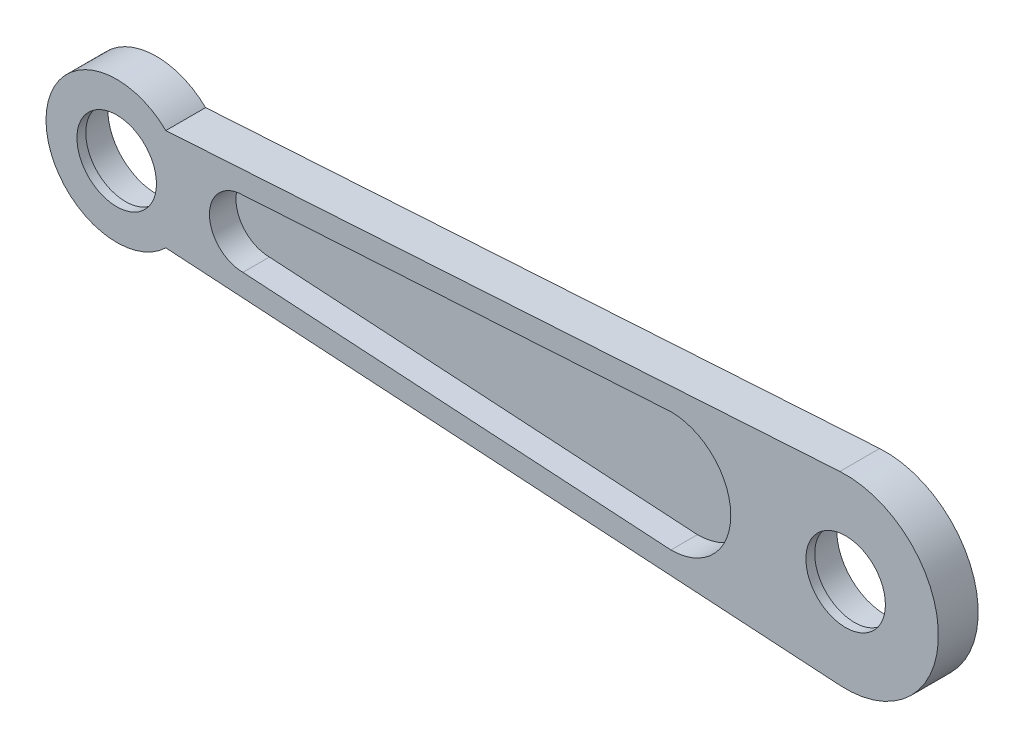
ISO-10303-21;
HEADER;
FILE_DESCRIPTION(('STEP AP214'),'2;1');
FILE_NAME('part.step','',(''),(''),'','','');
FILE_SCHEMA(('AUTOMOTIVE_DESIGN { 1 0 10303 214 1 1 1 1 }'));
ENDSEC;
DATA;
#1=APPLICATION_CONTEXT('core data for automotive mechanical design processes');
#2=APPLICATION_PROTOCOL_DEFINITION('international standard','automotive_design',2000,#1);
#3=PRODUCT_CONTEXT('',#1,'mechanical');
#4=PRODUCT('Part','Part','',(#3));
#5=PRODUCT_RELATED_PRODUCT_CATEGORY('part','',(#4));
#6=PRODUCT_DEFINITION_FORMATION('','',#4);
#7=PRODUCT_DEFINITION_CONTEXT('part definition',#1,'design');
#8=PRODUCT_DEFINITION('design','',#6,#7);
#9=PRODUCT_DEFINITION_SHAPE('','',#8);
#10=(LENGTH_UNIT() NAMED_UNIT(*) SI_UNIT(.MILLI.,.METRE.));
#11=(NAMED_UNIT(*) PLANE_ANGLE_UNIT() SI_UNIT($,.RADIAN.));
#12=(NAMED_UNIT(*) SI_UNIT($,.STERADIAN.) SOLID_ANGLE_UNIT());
#13=UNCERTAINTY_MEASURE_WITH_UNIT(LENGTH_MEASURE(1.E-05),#10,'distance_accuracy_value','');
#14=(GEOMETRIC_REPRESENTATION_CONTEXT(3) GLOBAL_UNCERTAINTY_ASSIGNED_CONTEXT((#13)) GLOBAL_UNIT_ASSIGNED_CONTEXT((#10,
#11,#12)) REPRESENTATION_CONTEXT('',''));
#15=CARTESIAN_POINT('',(0.,0.,0.));
#16=DIRECTION('',(0.,0.,1.));
#17=DIRECTION('',(1.,0.,0.));
#18=AXIS2_PLACEMENT_3D('',#15,#16,#17);
#19=CARTESIAN_POINT('',(0.,0.,9.));
#20=DIRECTION('',(0.,0.,1.));
#21=DIRECTION('',(1.,0.,0.));
#22=AXIS2_PLACEMENT_3D('',#19,#20,#21);
#23=PLANE('',#22);
#24=CARTESIAN_POINT('',(165.,0.,9.));
#25=DIRECTION('',(0.,0.,1.));
#26=DIRECTION('',(1.,0.,0.));
#27=AXIS2_PLACEMENT_3D('',#24,#25,#26);
#28=CIRCLE('',#27,9.00000000000001);
#29=CARTESIAN_POINT('',(174.,0.,9.));
#30=VERTEX_POINT('',#29);
#31=EDGE_CURVE('E211',#30,#30,#28,.T.);
#32=ORIENTED_EDGE('',*,*,#31,.F.);
#33=EDGE_LOOP('',(#32));
#34=FACE_BOUND('',#33,.T.);
#35=CARTESIAN_POINT('',(0.,0.,9.));
#36=DIRECTION('',(0.,0.,1.));
#37=DIRECTION('',(1.,0.,0.));
#38=AXIS2_PLACEMENT_3D('',#35,#36,#37);
#39=CIRCLE('',#38,9.);
#40=CARTESIAN_POINT('',(9.,0.,9.));
#41=VERTEX_POINT('',#40);
#42=EDGE_CURVE('E216',#41,#41,#39,.T.);
#43=ORIENTED_EDGE('',*,*,#42,.F.);
#44=EDGE_LOOP('',(#43));
#45=FACE_BOUND('',#44,.T.);
#46=DIRECTION('',(0.998083511417436,-0.0618813722911973,0.));
#47=VECTOR('',#46,1.);
#48=CARTESIAN_POINT('',(-0.667673619069252,-10.7688954773911,9.));
#49=LINE('',#48,#47);
#50=CARTESIAN_POINT('',(11.1242977306435,-11.5,9.));
#51=VERTEX_POINT('',#50);
#52=CARTESIAN_POINT('',(163.700491181885,-20.9597537397661,9.));
#53=VERTEX_POINT('',#52);
#54=EDGE_CURVE('E222',#51,#53,#49,.T.);
#55=ORIENTED_EDGE('',*,*,#54,.T.);
#56=CARTESIAN_POINT('',(165.,0.,9.));
#57=DIRECTION('',(0.,0.,1.));
#58=DIRECTION('',(1.,0.,0.));
#59=AXIS2_PLACEMENT_3D('',#56,#57,#58);
#60=CIRCLE('',#59,21.);
#61=CARTESIAN_POINT('',(163.700491181885,20.9597537397661,9.));
#62=VERTEX_POINT('',#61);
#63=EDGE_CURVE('E249',#53,#62,#60,.T.);
#64=ORIENTED_EDGE('',*,*,#63,.T.);
#65=DIRECTION('',(0.998083511417436,0.0618813722911973,0.));
#66=VECTOR('',#65,1.);
#67=CARTESIAN_POINT('',(-0.667673619069252,10.7688954773911,9.));
#68=LINE('',#67,#66);
#69=CARTESIAN_POINT('',(11.1242977306435,11.5,9.));
#70=VERTEX_POINT('',#69);
#71=EDGE_CURVE('E219',#70,#62,#68,.T.);
#72=ORIENTED_EDGE('',*,*,#71,.F.);
#73=CARTESIAN_POINT('',(0.,0.,9.));
#74=DIRECTION('',(0.,0.,1.));
#75=DIRECTION('',(1.,0.,0.));
#76=AXIS2_PLACEMENT_3D('',#73,#74,#75);
#77=CIRCLE('',#76,16.);
#78=EDGE_CURVE('E231',#70,#51,#77,.T.);
#79=ORIENTED_EDGE('',*,*,#78,.T.);
#80=EDGE_LOOP('',(#55,#64,#72,#79));
#81=FACE_BOUND('',#80,.T.);
#82=CARTESIAN_POINT('',(125.447559307516,0.,9.));
#83=DIRECTION('',(0.,0.,1.));
#84=DIRECTION('',(1.,0.,0.));
#85=AXIS2_PLACEMENT_3D('',#82,#83,#84);
#86=CIRCLE('',#85,13.5524406924829);
#87=CARTESIAN_POINT('',(125.447559307516,-13.5524406924829,9.));
#88=VERTEX_POINT('',#87);
#89=CARTESIAN_POINT('',(125.447559307516,13.5524406924829,9.));
#90=VERTEX_POINT('',#89);
#91=EDGE_CURVE('E172',#88,#90,#86,.T.);
#92=ORIENTED_EDGE('',*,*,#91,.F.);
#93=DIRECTION('',(-0.998100035070179,0.0616142840006099,0.));
#94=VECTOR('',#93,1.);
#95=CARTESIAN_POINT('',(-0.357198336085407,-5.78631526044067,9.));
#96=LINE('',#95,#94);
#97=CARTESIAN_POINT('',(28.5721706817332,-7.57217068173317,9.));
#98=VERTEX_POINT('',#97);
#99=EDGE_CURVE('E160',#88,#98,#96,.T.);
#100=ORIENTED_EDGE('',*,*,#99,.T.);
#101=CARTESIAN_POINT('',(28.5721706817332,0.,9.));
#102=DIRECTION('',(0.,0.,1.));
#103=DIRECTION('',(1.,0.,0.));
#104=AXIS2_PLACEMENT_3D('',#101,#102,#103);
#105=CIRCLE('',#104,7.57217068173317);
#106=CARTESIAN_POINT('',(28.5721706817332,7.57217068173317,8.99999999999999));
#107=VERTEX_POINT('',#106);
#108=EDGE_CURVE('E170',#107,#98,#105,.T.);
#109=ORIENTED_EDGE('',*,*,#108,.F.);
#110=DIRECTION('',(-0.998100035070179,-0.0616142840006099,0.));
#111=VECTOR('',#110,1.);
#112=CARTESIAN_POINT('',(-0.357198336085407,5.78631526044067,9.));
#113=LINE('',#112,#111);
#114=EDGE_CURVE('E97',#90,#107,#113,.T.);
#115=ORIENTED_EDGE('',*,*,#114,.F.);
#116=EDGE_LOOP('',(#92,#100,#109,#115));
#117=FACE_BOUND('',#116,.T.);
#118=ADVANCED_FACE('F79',(#34,#45,#81,#117),#23,.T.);
#119=CARTESIAN_POINT('',(-0.667673619069252,10.7688954773911,9.));
#120=DIRECTION('',(-0.0618813722911973,0.998083511417435,0.));
#121=DIRECTION('',(-0.998083511417436,-0.0618813722911973,0.));
#122=AXIS2_PLACEMENT_3D('',#119,#120,#121);
#123=PLANE('',#122);
#124=DIRECTION('',(0.998083511417436,0.0618813722911973,0.));
#125=VECTOR('',#124,1.);
#126=CARTESIAN_POINT('',(-0.667673619069252,10.7688954773911,0.));
#127=LINE('',#126,#125);
#128=CARTESIAN_POINT('',(11.1242977306435,11.5,0.));
#129=VERTEX_POINT('',#128);
#130=CARTESIAN_POINT('',(163.700491181885,20.9597537397661,0.));
#131=VERTEX_POINT('',#130);
#132=EDGE_CURVE('E230',#129,#131,#127,.T.);
#133=ORIENTED_EDGE('',*,*,#132,.F.);
#134=DIRECTION('',(0.,0.,-1.));
#135=VECTOR('',#134,1.);
#136=CARTESIAN_POINT('',(11.1242977306435,11.5,9.));
#137=LINE('',#136,#135);
#138=EDGE_CURVE('E87',#70,#129,#137,.T.);
#139=ORIENTED_EDGE('',*,*,#138,.F.);
#140=ORIENTED_EDGE('',*,*,#71,.T.);
#141=DIRECTION('',(0.,0.,-1.));
#142=VECTOR('',#141,1.);
#143=CARTESIAN_POINT('',(163.700491181885,20.9597537397661,9.));
#144=LINE('',#143,#142);
#145=EDGE_CURVE('E13',#62,#131,#144,.T.);
#146=ORIENTED_EDGE('',*,*,#145,.T.);
#147=EDGE_LOOP('',(#133,#139,#140,#146));
#148=FACE_BOUND('',#147,.T.);
#149=ADVANCED_FACE('F273',(#148),#123,.T.);
#150=CARTESIAN_POINT('',(-0.667673619069252,-10.7688954773911,9.));
#151=DIRECTION('',(0.0618813722911973,0.998083511417435,0.));
#152=DIRECTION('',(-0.998083511417436,0.0618813722911973,0.));
#153=AXIS2_PLACEMENT_3D('',#150,#151,#152);
#154=PLANE('',#153);
#155=DIRECTION('',(0.998083511417436,-0.0618813722911973,0.));
#156=VECTOR('',#155,1.);
#157=CARTESIAN_POINT('',(-0.667673619069252,-10.7688954773911,0.));
#158=LINE('',#157,#156);
#159=CARTESIAN_POINT('',(11.1242977306435,-11.5,0.));
#160=VERTEX_POINT('',#159);
#161=CARTESIAN_POINT('',(163.700491181885,-20.9597537397661,0.));
#162=VERTEX_POINT('',#161);
#163=EDGE_CURVE('E224',#160,#162,#158,.T.);
#164=ORIENTED_EDGE('',*,*,#163,.T.);
#165=DIRECTION('',(0.,0.,-1.));
#166=VECTOR('',#165,1.);
#167=CARTESIAN_POINT('',(163.700491181885,-20.9597537397661,9.));
#168=LINE('',#167,#166);
#169=EDGE_CURVE('E106',#53,#162,#168,.T.);
#170=ORIENTED_EDGE('',*,*,#169,.F.);
#171=ORIENTED_EDGE('',*,*,#54,.F.);
#172=DIRECTION('',(0.,0.,-1.));
#173=VECTOR('',#172,1.);
#174=CARTESIAN_POINT('',(11.1242977306435,-11.5,9.));
#175=LINE('',#174,#173);
#176=EDGE_CURVE('E238',#51,#160,#175,.T.);
#177=ORIENTED_EDGE('',*,*,#176,.T.);
#178=EDGE_LOOP('',(#164,#170,#171,#177));
#179=FACE_BOUND('',#178,.T.);
#180=ADVANCED_FACE('F280',(#179),#154,.F.);
#181=CARTESIAN_POINT('',(0.,0.,0.));
#182=DIRECTION('',(0.,0.,1.));
#183=DIRECTION('',(1.,0.,0.));
#184=AXIS2_PLACEMENT_3D('',#181,#182,#183);
#185=PLANE('',#184);
#186=CARTESIAN_POINT('',(165.,0.,0.));
#187=DIRECTION('',(0.,0.,1.));
#188=DIRECTION('',(1.,0.,0.));
#189=AXIS2_PLACEMENT_3D('',#186,#187,#188);
#190=CIRCLE('',#189,11.);
#191=CARTESIAN_POINT('',(176.,0.,0.));
#192=VERTEX_POINT('',#191);
#193=EDGE_CURVE('E194',#192,#192,#190,.T.);
#194=ORIENTED_EDGE('',*,*,#193,.T.);
#195=EDGE_LOOP('',(#194));
#196=FACE_BOUND('',#195,.T.);
#197=CARTESIAN_POINT('',(0.,0.,0.));
#198=DIRECTION('',(0.,0.,1.));
#199=DIRECTION('',(1.,0.,0.));
#200=AXIS2_PLACEMENT_3D('',#197,#198,#199);
#201=CIRCLE('',#200,11.);
#202=CARTESIAN_POINT('',(11.,0.,0.));
#203=VERTEX_POINT('',#202);
#204=EDGE_CURVE('E198',#203,#203,#201,.T.);
#205=ORIENTED_EDGE('',*,*,#204,.T.);
#206=EDGE_LOOP('',(#205));
#207=FACE_BOUND('',#206,.T.);
#208=ORIENTED_EDGE('',*,*,#132,.T.);
#209=CARTESIAN_POINT('',(165.,0.,0.));
#210=DIRECTION('',(0.,0.,1.));
#211=DIRECTION('',(1.,0.,0.));
#212=AXIS2_PLACEMENT_3D('',#209,#210,#211);
#213=CIRCLE('',#212,21.);
#214=EDGE_CURVE('E215',#162,#131,#213,.T.);
#215=ORIENTED_EDGE('',*,*,#214,.F.);
#216=ORIENTED_EDGE('',*,*,#163,.F.);
#217=CARTESIAN_POINT('',(0.,0.,0.));
#218=DIRECTION('',(0.,0.,1.));
#219=DIRECTION('',(1.,0.,0.));
#220=AXIS2_PLACEMENT_3D('',#217,#218,#219);
#221=CIRCLE('',#220,16.);
#222=EDGE_CURVE('E246',#129,#160,#221,.T.);
#223=ORIENTED_EDGE('',*,*,#222,.F.);
#224=EDGE_LOOP('',(#208,#215,#216,#223));
#225=FACE_BOUND('',#224,.T.);
#226=ADVANCED_FACE('F286',(#196,#207,#225),#185,.F.);
#227=CARTESIAN_POINT('',(165.,0.,9.));
#228=DIRECTION('',(0.,0.,-1.));
#229=DIRECTION('',(-1.,0.,0.));
#230=AXIS2_PLACEMENT_3D('',#227,#228,#229);
#231=CYLINDRICAL_SURFACE('',#230,21.);
#232=ORIENTED_EDGE('',*,*,#214,.T.);
#233=ORIENTED_EDGE('',*,*,#145,.F.);
#234=ORIENTED_EDGE('',*,*,#63,.F.);
#235=ORIENTED_EDGE('',*,*,#169,.T.);
#236=EDGE_LOOP('',(#232,#233,#234,#235));
#237=FACE_BOUND('',#236,.T.);
#238=ADVANCED_FACE('F81',(#237),#231,.T.);
#239=CARTESIAN_POINT('',(0.,0.,9.));
#240=DIRECTION('',(0.,0.,-1.));
#241=DIRECTION('',(-1.,0.,0.));
#242=AXIS2_PLACEMENT_3D('',#239,#240,#241);
#243=CYLINDRICAL_SURFACE('',#242,16.);
#244=ORIENTED_EDGE('',*,*,#78,.F.);
#245=ORIENTED_EDGE('',*,*,#138,.T.);
#246=ORIENTED_EDGE('',*,*,#222,.T.);
#247=ORIENTED_EDGE('',*,*,#176,.F.);
#248=EDGE_LOOP('',(#244,#245,#246,#247));
#249=FACE_BOUND('',#248,.T.);
#250=ADVANCED_FACE('F267',(#249),#243,.T.);
#251=CARTESIAN_POINT('',(0.,0.,9.));
#252=DIRECTION('',(0.,0.,-1.));
#253=DIRECTION('',(-1.,0.,0.));
#254=AXIS2_PLACEMENT_3D('',#251,#252,#253);
#255=CYLINDRICAL_SURFACE('',#254,9.);
#256=CARTESIAN_POINT('',(0.,0.,7.));
#257=DIRECTION('',(0.,0.,1.));
#258=DIRECTION('',(1.,0.,0.));
#259=AXIS2_PLACEMENT_3D('',#256,#257,#258);
#260=CIRCLE('',#259,9.);
#261=CARTESIAN_POINT('',(9.,0.,7.));
#262=VERTEX_POINT('',#261);
#263=EDGE_CURVE('E84',#262,#262,#260,.T.);
#264=ORIENTED_EDGE('',*,*,#263,.F.);
#265=EDGE_LOOP('',(#264));
#266=FACE_BOUND('',#265,.T.);
#267=ORIENTED_EDGE('',*,*,#42,.T.);
#268=EDGE_LOOP('',(#267));
#269=FACE_BOUND('',#268,.T.);
#270=ADVANCED_FACE('F264',(#266,#269),#255,.F.);
#271=CARTESIAN_POINT('',(165.,0.,9.));
#272=DIRECTION('',(0.,0.,-1.));
#273=DIRECTION('',(-1.,0.,0.));
#274=AXIS2_PLACEMENT_3D('',#271,#272,#273);
#275=CYLINDRICAL_SURFACE('',#274,9.00000000000001);
#276=CARTESIAN_POINT('',(165.,0.,7.));
#277=DIRECTION('',(0.,0.,1.));
#278=DIRECTION('',(1.,0.,0.));
#279=AXIS2_PLACEMENT_3D('',#276,#277,#278);
#280=CIRCLE('',#279,9.00000000000001);
#281=CARTESIAN_POINT('',(174.,0.,7.));
#282=VERTEX_POINT('',#281);
#283=EDGE_CURVE('E205',#282,#282,#280,.T.);
#284=ORIENTED_EDGE('',*,*,#283,.F.);
#285=EDGE_LOOP('',(#284));
#286=FACE_BOUND('',#285,.T.);
#287=ORIENTED_EDGE('',*,*,#31,.T.);
#288=EDGE_LOOP('',(#287));
#289=FACE_BOUND('',#288,.T.);
#290=ADVANCED_FACE('F268',(#286,#289),#275,.F.);
#291=CARTESIAN_POINT('',(165.,0.,40.1126983722081));
#292=DIRECTION('',(0.,0.,-1.));
#293=DIRECTION('',(-1.,0.,0.));
#294=AXIS2_PLACEMENT_3D('',#291,#292,#293);
#295=CYLINDRICAL_SURFACE('',#294,11.);
#296=ORIENTED_EDGE('',*,*,#193,.F.);
#297=EDGE_LOOP('',(#296));
#298=FACE_BOUND('',#297,.T.);
#299=CARTESIAN_POINT('',(165.,0.,7.));
#300=DIRECTION('',(0.,0.,1.));
#301=DIRECTION('',(1.,0.,0.));
#302=AXIS2_PLACEMENT_3D('',#299,#300,#301);
#303=CIRCLE('',#302,11.);
#304=CARTESIAN_POINT('',(176.,0.,7.));
#305=VERTEX_POINT('',#304);
#306=EDGE_CURVE('E200',#305,#305,#303,.T.);
#307=ORIENTED_EDGE('',*,*,#306,.T.);
#308=EDGE_LOOP('',(#307));
#309=FACE_BOUND('',#308,.T.);
#310=ADVANCED_FACE('F348',(#298,#309),#295,.F.);
#311=CARTESIAN_POINT('',(0.,0.,7.));
#312=DIRECTION('',(0.,0.,1.));
#313=DIRECTION('',(1.,0.,0.));
#314=AXIS2_PLACEMENT_3D('',#311,#312,#313);
#315=PLANE('',#314);
#316=ORIENTED_EDGE('',*,*,#283,.T.);
#317=EDGE_LOOP('',(#316));
#318=FACE_BOUND('',#317,.T.);
#319=ORIENTED_EDGE('',*,*,#306,.F.);
#320=EDGE_LOOP('',(#319));
#321=FACE_BOUND('',#320,.T.);
#322=ADVANCED_FACE('F356',(#318,#321),#315,.F.);
#323=CARTESIAN_POINT('',(0.,0.,40.1126983722081));
#324=DIRECTION('',(0.,0.,-1.));
#325=DIRECTION('',(-1.,0.,0.));
#326=AXIS2_PLACEMENT_3D('',#323,#324,#325);
#327=CYLINDRICAL_SURFACE('',#326,11.);
#328=ORIENTED_EDGE('',*,*,#204,.F.);
#329=EDGE_LOOP('',(#328));
#330=FACE_BOUND('',#329,.T.);
#331=CARTESIAN_POINT('',(0.,0.,7.));
#332=DIRECTION('',(0.,0.,1.));
#333=DIRECTION('',(1.,0.,0.));
#334=AXIS2_PLACEMENT_3D('',#331,#332,#333);
#335=CIRCLE('',#334,11.);
#336=CARTESIAN_POINT('',(11.,0.,7.));
#337=VERTEX_POINT('',#336);
#338=EDGE_CURVE('E203',#337,#337,#335,.T.);
#339=ORIENTED_EDGE('',*,*,#338,.T.);
#340=EDGE_LOOP('',(#339));
#341=FACE_BOUND('',#340,.T.);
#342=ADVANCED_FACE('F368',(#330,#341),#327,.F.);
#343=CARTESIAN_POINT('',(0.,0.,7.));
#344=DIRECTION('',(0.,0.,1.));
#345=DIRECTION('',(1.,0.,0.));
#346=AXIS2_PLACEMENT_3D('',#343,#344,#345);
#347=PLANE('',#346);
#348=ORIENTED_EDGE('',*,*,#263,.T.);
#349=EDGE_LOOP('',(#348));
#350=FACE_BOUND('',#349,.T.);
#351=ORIENTED_EDGE('',*,*,#338,.F.);
#352=EDGE_LOOP('',(#351));
#353=FACE_BOUND('',#352,.T.);
#354=ADVANCED_FACE('F265',(#350,#353),#347,.F.);
#355=CARTESIAN_POINT('',(-0.357198336085407,-5.78631526044067,-121.073013487287));
#356=DIRECTION('',(0.0616142840006099,0.998100035070179,0.));
#357=DIRECTION('',(-0.998100035070179,0.0616142840006099,0.));
#358=AXIS2_PLACEMENT_3D('',#355,#356,#357);
#359=PLANE('',#358);
#360=DIRECTION('',(0.,0.,1.));
#361=VECTOR('',#360,1.);
#362=CARTESIAN_POINT('',(28.5721706817332,-7.57217068173317,-121.073013487287));
#363=LINE('',#362,#361);
#364=CARTESIAN_POINT('',(28.5721706817332,-7.57217068173317,3.));
#365=VERTEX_POINT('',#364);
#366=EDGE_CURVE('E155',#365,#98,#363,.T.);
#367=ORIENTED_EDGE('',*,*,#366,.T.);
#368=ORIENTED_EDGE('',*,*,#99,.F.);
#369=DIRECTION('',(0.,0.,1.));
#370=VECTOR('',#369,1.);
#371=CARTESIAN_POINT('',(125.447559307516,-13.5524406924829,-121.073013487287));
#372=LINE('',#371,#370);
#373=CARTESIAN_POINT('',(125.447559307516,-13.5524406924829,3.));
#374=VERTEX_POINT('',#373);
#375=EDGE_CURVE('E165',#374,#88,#372,.T.);
#376=ORIENTED_EDGE('',*,*,#375,.F.);
#377=DIRECTION('',(0.998100035070179,-0.0616142840006099,0.));
#378=VECTOR('',#377,1.);
#379=CARTESIAN_POINT('',(-0.357198336085407,-5.78631526044067,3.));
#380=LINE('',#379,#378);
#381=EDGE_CURVE('E159',#365,#374,#380,.T.);
#382=ORIENTED_EDGE('',*,*,#381,.F.);
#383=EDGE_LOOP('',(#367,#368,#376,#382));
#384=FACE_BOUND('',#383,.T.);
#385=ADVANCED_FACE('F152',(#384),#359,.T.);
#386=CARTESIAN_POINT('',(125.447559307516,0.,-121.073013487287));
#387=DIRECTION('',(0.,0.,1.));
#388=DIRECTION('',(1.,0.,0.));
#389=AXIS2_PLACEMENT_3D('',#386,#387,#388);
#390=CYLINDRICAL_SURFACE('',#389,13.5524406924829);
#391=CARTESIAN_POINT('',(125.447559307516,0.,3.));
#392=DIRECTION('',(0.,0.,1.));
#393=DIRECTION('',(1.,0.,0.));
#394=AXIS2_PLACEMENT_3D('',#391,#392,#393);
#395=CIRCLE('',#394,13.5524406924829);
#396=CARTESIAN_POINT('',(125.447559307516,13.5524406924829,3.));
#397=VERTEX_POINT('',#396);
#398=EDGE_CURVE('E192',#397,#374,#395,.F.);
#399=ORIENTED_EDGE('',*,*,#398,.T.);
#400=ORIENTED_EDGE('',*,*,#375,.T.);
#401=ORIENTED_EDGE('',*,*,#91,.T.);
#402=DIRECTION('',(0.,0.,1.));
#403=VECTOR('',#402,1.);
#404=CARTESIAN_POINT('',(125.447559307516,13.5524406924829,-121.073013487287));
#405=LINE('',#404,#403);
#406=EDGE_CURVE('E184',#397,#90,#405,.T.);
#407=ORIENTED_EDGE('',*,*,#406,.F.);
#408=EDGE_LOOP('',(#399,#400,#401,#407));
#409=FACE_BOUND('',#408,.T.);
#410=ADVANCED_FACE('F409',(#409),#390,.F.);
#411=CARTESIAN_POINT('',(-0.357198336085407,5.78631526044067,-121.073013487287));
#412=DIRECTION('',(-0.0616142840006099,0.998100035070179,0.));
#413=DIRECTION('',(-0.998100035070179,-0.0616142840006099,0.));
#414=AXIS2_PLACEMENT_3D('',#411,#412,#413);
#415=PLANE('',#414);
#416=DIRECTION('',(0.998100035070179,0.0616142840006099,0.));
#417=VECTOR('',#416,1.);
#418=CARTESIAN_POINT('',(-0.357198336085407,5.78631526044067,3.));
#419=LINE('',#418,#417);
#420=CARTESIAN_POINT('',(28.5721706817332,7.57217068173317,3.));
#421=VERTEX_POINT('',#420);
#422=EDGE_CURVE('E446',#421,#397,#419,.T.);
#423=ORIENTED_EDGE('',*,*,#422,.T.);
#424=ORIENTED_EDGE('',*,*,#406,.T.);
#425=ORIENTED_EDGE('',*,*,#114,.T.);
#426=DIRECTION('',(0.,0.,1.));
#427=VECTOR('',#426,1.);
#428=CARTESIAN_POINT('',(28.5721706817332,7.57217068173317,-121.073013487287));
#429=LINE('',#428,#427);
#430=EDGE_CURVE('E169',#421,#107,#429,.T.);
#431=ORIENTED_EDGE('',*,*,#430,.F.);
#432=EDGE_LOOP('',(#423,#424,#425,#431));
#433=FACE_BOUND('',#432,.T.);
#434=ADVANCED_FACE('F420',(#433),#415,.F.);
#435=CARTESIAN_POINT('',(28.5721706817332,0.,-121.073013487287));
#436=DIRECTION('',(0.,0.,1.));
#437=DIRECTION('',(1.,0.,0.));
#438=AXIS2_PLACEMENT_3D('',#435,#436,#437);
#439=CYLINDRICAL_SURFACE('',#438,7.57217068173317);
#440=CARTESIAN_POINT('',(28.5721706817332,0.,3.));
#441=DIRECTION('',(0.,0.,1.));
#442=DIRECTION('',(1.,0.,0.));
#443=AXIS2_PLACEMENT_3D('',#440,#441,#442);
#444=CIRCLE('',#443,7.57217068173317);
#445=EDGE_CURVE('E210',#365,#421,#444,.F.);
#446=ORIENTED_EDGE('',*,*,#445,.T.);
#447=ORIENTED_EDGE('',*,*,#430,.T.);
#448=ORIENTED_EDGE('',*,*,#108,.T.);
#449=ORIENTED_EDGE('',*,*,#366,.F.);
#450=EDGE_LOOP('',(#446,#447,#448,#449));
#451=FACE_BOUND('',#450,.T.);
#452=ADVANCED_FACE('F166',(#451),#439,.F.);
#453=CARTESIAN_POINT('',(0.,0.,3.));
#454=DIRECTION('',(0.,0.,1.));
#455=DIRECTION('',(1.,0.,0.));
#456=AXIS2_PLACEMENT_3D('',#453,#454,#455);
#457=PLANE('',#456);
#458=ORIENTED_EDGE('',*,*,#445,.F.);
#459=ORIENTED_EDGE('',*,*,#381,.T.);
#460=ORIENTED_EDGE('',*,*,#398,.F.);
#461=ORIENTED_EDGE('',*,*,#422,.F.);
#462=EDGE_LOOP('',(#458,#459,#460,#461));
#463=FACE_BOUND('',#462,.T.);
#464=ADVANCED_FACE('F434',(#463),#457,.T.);
#465=CLOSED_SHELL('',(#118,#149,#180,#226,#238,#250,#270,#290,#310,#322,#342,#354,#385,#410,
#434,#452,#464));
#466=MANIFOLD_SOLID_BREP('B2',#465);
#467=ADVANCED_BREP_SHAPE_REPRESENTATION('',(#18,#466),#14);
#468=SHAPE_DEFINITION_REPRESENTATION(#9,#467);
ENDSEC;
END-ISO-10303-21;
